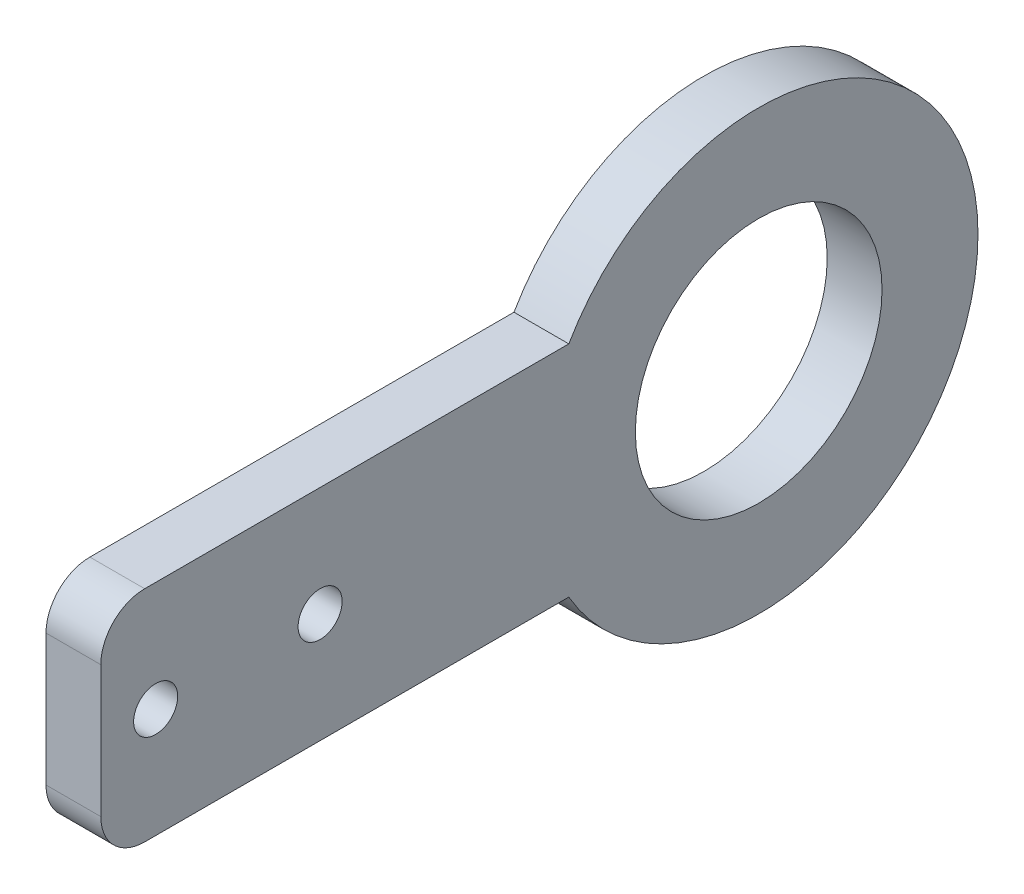
ISO-10303-21;
HEADER;
FILE_DESCRIPTION(('STEP AP214'),'2;1');
FILE_NAME('part.step','',(''),(''),'','','');
FILE_SCHEMA(('AUTOMOTIVE_DESIGN { 1 0 10303 214 1 1 1 1 }'));
ENDSEC;
DATA;
#1=APPLICATION_CONTEXT('core data for automotive mechanical design processes');
#2=APPLICATION_PROTOCOL_DEFINITION('international standard','automotive_design',2000,#1);
#3=PRODUCT_CONTEXT('',#1,'mechanical');
#4=PRODUCT('Part','Part','',(#3));
#5=PRODUCT_RELATED_PRODUCT_CATEGORY('part','',(#4));
#6=PRODUCT_DEFINITION_FORMATION('','',#4);
#7=PRODUCT_DEFINITION_CONTEXT('part definition',#1,'design');
#8=PRODUCT_DEFINITION('design','',#6,#7);
#9=PRODUCT_DEFINITION_SHAPE('','',#8);
#10=(LENGTH_UNIT() NAMED_UNIT(*) SI_UNIT(.MILLI.,.METRE.));
#11=(NAMED_UNIT(*) PLANE_ANGLE_UNIT() SI_UNIT($,.RADIAN.));
#12=(NAMED_UNIT(*) SI_UNIT($,.STERADIAN.) SOLID_ANGLE_UNIT());
#13=UNCERTAINTY_MEASURE_WITH_UNIT(LENGTH_MEASURE(1.E-05),#10,'distance_accuracy_value','');
#14=(GEOMETRIC_REPRESENTATION_CONTEXT(3) GLOBAL_UNCERTAINTY_ASSIGNED_CONTEXT((#13)) GLOBAL_UNIT_ASSIGNED_CONTEXT((#10,
#11,#12)) REPRESENTATION_CONTEXT('',''));
#15=CARTESIAN_POINT('',(0.,0.,0.));
#16=DIRECTION('',(0.,0.,1.));
#17=DIRECTION('',(1.,0.,0.));
#18=AXIS2_PLACEMENT_3D('',#15,#16,#17);
#19=CARTESIAN_POINT('',(3.175,12.7,44.45));
#20=DIRECTION('',(0.,-1.,0.));
#21=DIRECTION('',(0.,0.,-1.));
#22=AXIS2_PLACEMENT_3D('',#19,#20,#21);
#23=PLANE('',#22);
#24=DIRECTION('',(0.,0.,1.));
#25=VECTOR('',#24,1.);
#26=CARTESIAN_POINT('',(3.175,12.7,44.45));
#27=LINE('',#26,#25);
#28=CARTESIAN_POINT('',(3.175,12.7,-9.75295474387525));
#29=VERTEX_POINT('',#28);
#30=CARTESIAN_POINT('',(3.175,12.7,39.37));
#31=VERTEX_POINT('',#30);
#32=EDGE_CURVE('E52',#29,#31,#27,.T.);
#33=ORIENTED_EDGE('',*,*,#32,.F.);
#34=DIRECTION('',(1.,0.,0.));
#35=VECTOR('',#34,1.);
#36=CARTESIAN_POINT('',(-75.0170489685532,12.7,-9.75295474387525));
#37=LINE('',#36,#35);
#38=CARTESIAN_POINT('',(-3.175,12.7,-9.75295474387525));
#39=VERTEX_POINT('',#38);
#40=EDGE_CURVE('E91',#29,#39,#37,.F.);
#41=ORIENTED_EDGE('',*,*,#40,.T.);
#42=DIRECTION('',(0.,0.,1.));
#43=VECTOR('',#42,1.);
#44=CARTESIAN_POINT('',(-3.175,12.7,44.45));
#45=LINE('',#44,#43);
#46=CARTESIAN_POINT('',(-3.175,12.7,39.37));
#47=VERTEX_POINT('',#46);
#48=EDGE_CURVE('E124',#39,#47,#45,.T.);
#49=ORIENTED_EDGE('',*,*,#48,.T.);
#50=DIRECTION('',(-1.,0.,0.));
#51=VECTOR('',#50,1.);
#52=CARTESIAN_POINT('',(3.175,12.7,39.37));
#53=LINE('',#52,#51);
#54=EDGE_CURVE('E11',#47,#31,#53,.F.);
#55=ORIENTED_EDGE('',*,*,#54,.T.);
#56=EDGE_LOOP('',(#33,#41,#49,#55));
#57=FACE_BOUND('',#56,.T.);
#58=ADVANCED_FACE('F37',(#57),#23,.F.);
#59=CARTESIAN_POINT('',(3.175,-12.7,44.45));
#60=DIRECTION('',(0.,0.,-1.));
#61=DIRECTION('',(-1.,0.,0.));
#62=AXIS2_PLACEMENT_3D('',#59,#60,#61);
#63=PLANE('',#62);
#64=DIRECTION('',(0.,-1.,0.));
#65=VECTOR('',#64,1.);
#66=CARTESIAN_POINT('',(-3.175,-12.7,44.45));
#67=LINE('',#66,#65);
#68=CARTESIAN_POINT('',(-3.175,7.62,44.45));
#69=VERTEX_POINT('',#68);
#70=CARTESIAN_POINT('',(-3.175,-7.62000000000001,44.45));
#71=VERTEX_POINT('',#70);
#72=EDGE_CURVE('E116',#69,#71,#67,.T.);
#73=ORIENTED_EDGE('',*,*,#72,.T.);
#74=DIRECTION('',(-1.,0.,0.));
#75=VECTOR('',#74,1.);
#76=CARTESIAN_POINT('',(3.175,-7.62000000000001,44.45));
#77=LINE('',#76,#75);
#78=CARTESIAN_POINT('',(3.175,-7.62000000000001,44.45));
#79=VERTEX_POINT('',#78);
#80=EDGE_CURVE('E59',#71,#79,#77,.F.);
#81=ORIENTED_EDGE('',*,*,#80,.T.);
#82=DIRECTION('',(0.,-1.,0.));
#83=VECTOR('',#82,1.);
#84=CARTESIAN_POINT('',(3.175,-12.7,44.45));
#85=LINE('',#84,#83);
#86=CARTESIAN_POINT('',(3.175,7.62,44.45));
#87=VERTEX_POINT('',#86);
#88=EDGE_CURVE('E111',#87,#79,#85,.T.);
#89=ORIENTED_EDGE('',*,*,#88,.F.);
#90=DIRECTION('',(-1.,0.,0.));
#91=VECTOR('',#90,1.);
#92=CARTESIAN_POINT('',(3.175,7.62,44.45));
#93=LINE('',#92,#91);
#94=EDGE_CURVE('E134',#87,#69,#93,.T.);
#95=ORIENTED_EDGE('',*,*,#94,.T.);
#96=EDGE_LOOP('',(#73,#81,#89,#95));
#97=FACE_BOUND('',#96,.T.);
#98=ADVANCED_FACE('F150',(#97),#63,.F.);
#99=CARTESIAN_POINT('',(3.175,-12.7,44.45));
#100=DIRECTION('',(0.,1.,0.));
#101=DIRECTION('',(0.,0.,1.));
#102=AXIS2_PLACEMENT_3D('',#99,#100,#101);
#103=PLANE('',#102);
#104=DIRECTION('',(0.,0.,-1.));
#105=VECTOR('',#104,1.);
#106=CARTESIAN_POINT('',(-3.175,-12.7,44.45));
#107=LINE('',#106,#105);
#108=CARTESIAN_POINT('',(-3.175,-12.7,39.37));
#109=VERTEX_POINT('',#108);
#110=CARTESIAN_POINT('',(-3.175,-12.7,-9.75295474387525));
#111=VERTEX_POINT('',#110);
#112=EDGE_CURVE('E112',#109,#111,#107,.T.);
#113=ORIENTED_EDGE('',*,*,#112,.T.);
#114=DIRECTION('',(1.,0.,0.));
#115=VECTOR('',#114,1.);
#116=CARTESIAN_POINT('',(-75.0170489685532,-12.7,-9.75295474387525));
#117=LINE('',#116,#115);
#118=CARTESIAN_POINT('',(3.175,-12.7,-9.75295474387525));
#119=VERTEX_POINT('',#118);
#120=EDGE_CURVE('E100',#111,#119,#117,.T.);
#121=ORIENTED_EDGE('',*,*,#120,.T.);
#122=DIRECTION('',(0.,0.,-1.));
#123=VECTOR('',#122,1.);
#124=CARTESIAN_POINT('',(3.175,-12.7,44.45));
#125=LINE('',#124,#123);
#126=CARTESIAN_POINT('',(3.175,-12.7,39.37));
#127=VERTEX_POINT('',#126);
#128=EDGE_CURVE('E106',#127,#119,#125,.T.);
#129=ORIENTED_EDGE('',*,*,#128,.F.);
#130=DIRECTION('',(-1.,0.,0.));
#131=VECTOR('',#130,1.);
#132=CARTESIAN_POINT('',(3.175,-12.7,39.37));
#133=LINE('',#132,#131);
#134=EDGE_CURVE('E123',#127,#109,#133,.T.);
#135=ORIENTED_EDGE('',*,*,#134,.T.);
#136=EDGE_LOOP('',(#113,#121,#129,#135));
#137=FACE_BOUND('',#136,.T.);
#138=ADVANCED_FACE('F143',(#137),#103,.F.);
#139=CARTESIAN_POINT('',(3.175,0.,0.));
#140=DIRECTION('',(-1.,0.,0.));
#141=DIRECTION('',(0.,0.,1.));
#142=AXIS2_PLACEMENT_3D('',#139,#140,#141);
#143=PLANE('',#142);
#144=CARTESIAN_POINT('',(3.175,0.,-31.75));
#145=DIRECTION('',(1.,0.,0.));
#146=DIRECTION('',(0.,0.,-1.));
#147=AXIS2_PLACEMENT_3D('',#144,#145,#146);
#148=CIRCLE('',#147,14.2875);
#149=CARTESIAN_POINT('',(3.175,0.,-46.0375));
#150=VERTEX_POINT('',#149);
#151=EDGE_CURVE('E210',#150,#150,#148,.T.);
#152=ORIENTED_EDGE('',*,*,#151,.F.);
#153=EDGE_LOOP('',(#152));
#154=FACE_BOUND('',#153,.T.);
#155=CARTESIAN_POINT('',(3.175,0.,-31.75));
#156=DIRECTION('',(1.,0.,0.));
#157=DIRECTION('',(0.,0.,-1.));
#158=AXIS2_PLACEMENT_3D('',#155,#156,#157);
#159=CIRCLE('',#158,25.4);
#160=EDGE_CURVE('E93',#119,#29,#159,.T.);
#161=ORIENTED_EDGE('',*,*,#160,.T.);
#162=ORIENTED_EDGE('',*,*,#32,.T.);
#163=CARTESIAN_POINT('',(3.175,7.62,39.37));
#164=DIRECTION('',(-1.,0.,0.));
#165=DIRECTION('',(0.,0.,1.));
#166=AXIS2_PLACEMENT_3D('',#163,#164,#165);
#167=CIRCLE('',#166,5.08);
#168=EDGE_CURVE('E138',#31,#87,#167,.F.);
#169=ORIENTED_EDGE('',*,*,#168,.T.);
#170=ORIENTED_EDGE('',*,*,#88,.T.);
#171=CARTESIAN_POINT('',(3.175,-7.62000000000001,39.37));
#172=DIRECTION('',(-1.,0.,0.));
#173=DIRECTION('',(0.,0.,1.));
#174=AXIS2_PLACEMENT_3D('',#171,#172,#173);
#175=CIRCLE('',#174,5.08);
#176=EDGE_CURVE('E45',#79,#127,#175,.F.);
#177=ORIENTED_EDGE('',*,*,#176,.T.);
#178=ORIENTED_EDGE('',*,*,#128,.T.);
#179=EDGE_LOOP('',(#161,#162,#169,#170,#177,#178));
#180=FACE_BOUND('',#179,.T.);
#181=CARTESIAN_POINT('',(3.175,0.,19.05));
#182=DIRECTION('',(1.,0.,0.));
#183=DIRECTION('',(0.,0.,-1.));
#184=AXIS2_PLACEMENT_3D('',#181,#182,#183);
#185=CIRCLE('',#184,2.5527);
#186=CARTESIAN_POINT('',(3.175,0.,16.4973));
#187=VERTEX_POINT('',#186);
#188=EDGE_CURVE('E99',#187,#187,#185,.T.);
#189=ORIENTED_EDGE('',*,*,#188,.F.);
#190=EDGE_LOOP('',(#189));
#191=FACE_BOUND('',#190,.T.);
#192=CARTESIAN_POINT('',(3.175,0.,38.1));
#193=DIRECTION('',(1.,0.,0.));
#194=DIRECTION('',(0.,0.,-1.));
#195=AXIS2_PLACEMENT_3D('',#192,#193,#194);
#196=CIRCLE('',#195,2.5527);
#197=CARTESIAN_POINT('',(3.175,0.,35.5473));
#198=VERTEX_POINT('',#197);
#199=EDGE_CURVE('E161',#198,#198,#196,.T.);
#200=ORIENTED_EDGE('',*,*,#199,.F.);
#201=EDGE_LOOP('',(#200));
#202=FACE_BOUND('',#201,.T.);
#203=ADVANCED_FACE('F103',(#154,#180,#191,#202),#143,.F.);
#204=CARTESIAN_POINT('',(-3.175,0.,0.));
#205=DIRECTION('',(-1.,0.,0.));
#206=DIRECTION('',(0.,0.,1.));
#207=AXIS2_PLACEMENT_3D('',#204,#205,#206);
#208=PLANE('',#207);
#209=CARTESIAN_POINT('',(-3.175,0.,-31.75));
#210=DIRECTION('',(1.,0.,0.));
#211=DIRECTION('',(0.,0.,-1.));
#212=AXIS2_PLACEMENT_3D('',#209,#210,#211);
#213=CIRCLE('',#212,14.2875);
#214=CARTESIAN_POINT('',(-3.175,0.,-46.0375));
#215=VERTEX_POINT('',#214);
#216=EDGE_CURVE('E107',#215,#215,#213,.T.);
#217=ORIENTED_EDGE('',*,*,#216,.T.);
#218=EDGE_LOOP('',(#217));
#219=FACE_BOUND('',#218,.T.);
#220=ORIENTED_EDGE('',*,*,#48,.F.);
#221=CARTESIAN_POINT('',(-3.175,0.,-31.75));
#222=DIRECTION('',(-1.,0.,0.));
#223=DIRECTION('',(0.,0.,1.));
#224=AXIS2_PLACEMENT_3D('',#221,#222,#223);
#225=CIRCLE('',#224,25.4);
#226=EDGE_CURVE('E96',#111,#39,#225,.F.);
#227=ORIENTED_EDGE('',*,*,#226,.F.);
#228=ORIENTED_EDGE('',*,*,#112,.F.);
#229=CARTESIAN_POINT('',(-3.175,-7.62000000000001,39.37));
#230=DIRECTION('',(-1.,0.,0.));
#231=DIRECTION('',(0.,0.,1.));
#232=AXIS2_PLACEMENT_3D('',#229,#230,#231);
#233=CIRCLE('',#232,5.08);
#234=EDGE_CURVE('E132',#109,#71,#233,.T.);
#235=ORIENTED_EDGE('',*,*,#234,.T.);
#236=ORIENTED_EDGE('',*,*,#72,.F.);
#237=CARTESIAN_POINT('',(-3.175,7.62,39.37));
#238=DIRECTION('',(-1.,0.,0.));
#239=DIRECTION('',(0.,0.,1.));
#240=AXIS2_PLACEMENT_3D('',#237,#238,#239);
#241=CIRCLE('',#240,5.08);
#242=EDGE_CURVE('E129',#69,#47,#241,.T.);
#243=ORIENTED_EDGE('',*,*,#242,.T.);
#244=EDGE_LOOP('',(#220,#227,#228,#235,#236,#243));
#245=FACE_BOUND('',#244,.T.);
#246=CARTESIAN_POINT('',(-3.175,0.,19.05));
#247=DIRECTION('',(1.,0.,0.));
#248=DIRECTION('',(0.,0.,-1.));
#249=AXIS2_PLACEMENT_3D('',#246,#247,#248);
#250=CIRCLE('',#249,2.5527);
#251=CARTESIAN_POINT('',(-3.175,0.,16.4973));
#252=VERTEX_POINT('',#251);
#253=EDGE_CURVE('E159',#252,#252,#250,.T.);
#254=ORIENTED_EDGE('',*,*,#253,.T.);
#255=EDGE_LOOP('',(#254));
#256=FACE_BOUND('',#255,.T.);
#257=CARTESIAN_POINT('',(-3.175,0.,38.1));
#258=DIRECTION('',(1.,0.,0.));
#259=DIRECTION('',(0.,0.,-1.));
#260=AXIS2_PLACEMENT_3D('',#257,#258,#259);
#261=CIRCLE('',#260,2.5527);
#262=CARTESIAN_POINT('',(-3.175,0.,35.5473));
#263=VERTEX_POINT('',#262);
#264=EDGE_CURVE('E119',#263,#263,#261,.T.);
#265=ORIENTED_EDGE('',*,*,#264,.T.);
#266=EDGE_LOOP('',(#265));
#267=FACE_BOUND('',#266,.T.);
#268=ADVANCED_FACE('F148',(#219,#245,#256,#267),#208,.T.);
#269=CARTESIAN_POINT('',(3.175,0.,38.1));
#270=DIRECTION('',(1.,0.,0.));
#271=DIRECTION('',(0.,0.,-1.));
#272=AXIS2_PLACEMENT_3D('',#269,#270,#271);
#273=CYLINDRICAL_SURFACE('',#272,2.5527);
#274=ORIENTED_EDGE('',*,*,#264,.F.);
#275=EDGE_LOOP('',(#274));
#276=FACE_BOUND('',#275,.T.);
#277=ORIENTED_EDGE('',*,*,#199,.T.);
#278=EDGE_LOOP('',(#277));
#279=FACE_BOUND('',#278,.T.);
#280=ADVANCED_FACE('F169',(#276,#279),#273,.F.);
#281=CARTESIAN_POINT('',(3.175,0.,19.05));
#282=DIRECTION('',(1.,0.,0.));
#283=DIRECTION('',(0.,0.,-1.));
#284=AXIS2_PLACEMENT_3D('',#281,#282,#283);
#285=CYLINDRICAL_SURFACE('',#284,2.5527);
#286=ORIENTED_EDGE('',*,*,#253,.F.);
#287=EDGE_LOOP('',(#286));
#288=FACE_BOUND('',#287,.T.);
#289=ORIENTED_EDGE('',*,*,#188,.T.);
#290=EDGE_LOOP('',(#289));
#291=FACE_BOUND('',#290,.T.);
#292=ADVANCED_FACE('F171',(#288,#291),#285,.F.);
#293=CARTESIAN_POINT('',(3.175,-7.62000000000001,39.37));
#294=DIRECTION('',(-1.,0.,0.));
#295=DIRECTION('',(0.,0.,1.));
#296=AXIS2_PLACEMENT_3D('',#293,#294,#295);
#297=CYLINDRICAL_SURFACE('',#296,5.08);
#298=ORIENTED_EDGE('',*,*,#176,.F.);
#299=ORIENTED_EDGE('',*,*,#80,.F.);
#300=ORIENTED_EDGE('',*,*,#234,.F.);
#301=ORIENTED_EDGE('',*,*,#134,.F.);
#302=EDGE_LOOP('',(#298,#299,#300,#301));
#303=FACE_BOUND('',#302,.T.);
#304=ADVANCED_FACE('F145',(#303),#297,.T.);
#305=CARTESIAN_POINT('',(3.175,7.62,39.37));
#306=DIRECTION('',(-1.,0.,0.));
#307=DIRECTION('',(0.,0.,1.));
#308=AXIS2_PLACEMENT_3D('',#305,#306,#307);
#309=CYLINDRICAL_SURFACE('',#308,5.08);
#310=ORIENTED_EDGE('',*,*,#168,.F.);
#311=ORIENTED_EDGE('',*,*,#54,.F.);
#312=ORIENTED_EDGE('',*,*,#242,.F.);
#313=ORIENTED_EDGE('',*,*,#94,.F.);
#314=EDGE_LOOP('',(#310,#311,#312,#313));
#315=FACE_BOUND('',#314,.T.);
#316=ADVANCED_FACE('F39',(#315),#309,.T.);
#317=CARTESIAN_POINT('',(-75.0170489685532,0.,-31.75));
#318=DIRECTION('',(1.,0.,0.));
#319=DIRECTION('',(0.,0.,-1.));
#320=AXIS2_PLACEMENT_3D('',#317,#318,#319);
#321=CYLINDRICAL_SURFACE('',#320,25.4);
#322=ORIENTED_EDGE('',*,*,#40,.F.);
#323=ORIENTED_EDGE('',*,*,#160,.F.);
#324=ORIENTED_EDGE('',*,*,#120,.F.);
#325=ORIENTED_EDGE('',*,*,#226,.T.);
#326=EDGE_LOOP('',(#322,#323,#324,#325));
#327=FACE_BOUND('',#326,.T.);
#328=ADVANCED_FACE('F92',(#327),#321,.T.);
#329=CARTESIAN_POINT('',(-3.175,0.,-31.75));
#330=DIRECTION('',(1.,0.,0.));
#331=DIRECTION('',(0.,0.,-1.));
#332=AXIS2_PLACEMENT_3D('',#329,#330,#331);
#333=CYLINDRICAL_SURFACE('',#332,14.2875);
#334=ORIENTED_EDGE('',*,*,#216,.F.);
#335=EDGE_LOOP('',(#334));
#336=FACE_BOUND('',#335,.T.);
#337=ORIENTED_EDGE('',*,*,#151,.T.);
#338=EDGE_LOOP('',(#337));
#339=FACE_BOUND('',#338,.T.);
#340=ADVANCED_FACE('F196',(#336,#339),#333,.F.);
#341=CLOSED_SHELL('',(#58,#98,#138,#203,#268,#280,#292,#304,#316,#328,#340));
#342=MANIFOLD_SOLID_BREP('B2',#341);
#343=ADVANCED_BREP_SHAPE_REPRESENTATION('',(#18,#342),#14);
#344=SHAPE_DEFINITION_REPRESENTATION(#9,#343);
ENDSEC;
END-ISO-10303-21;
